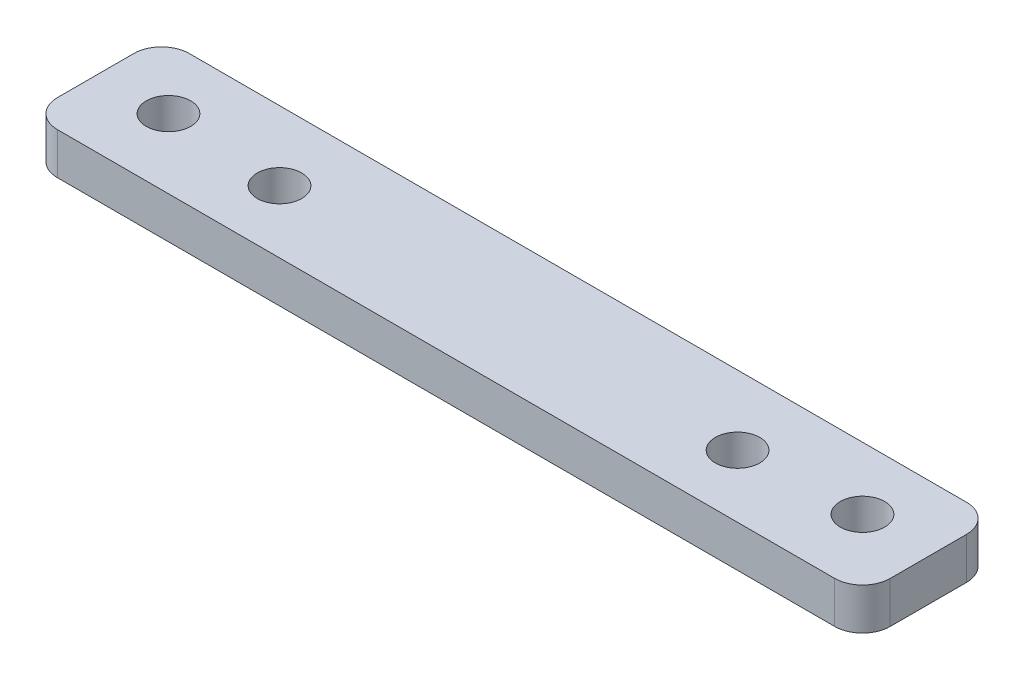
ISO-10303-21;
HEADER;
FILE_DESCRIPTION(('STEP AP214'),'2;1');
FILE_NAME('part.step','',(''),(''),'','','');
FILE_SCHEMA(('AUTOMOTIVE_DESIGN { 1 0 10303 214 1 1 1 1 }'));
ENDSEC;
DATA;
#1=APPLICATION_CONTEXT('core data for automotive mechanical design processes');
#2=APPLICATION_PROTOCOL_DEFINITION('international standard','automotive_design',2000,#1);
#3=PRODUCT_CONTEXT('',#1,'mechanical');
#4=PRODUCT('Part','Part','',(#3));
#5=PRODUCT_RELATED_PRODUCT_CATEGORY('part','',(#4));
#6=PRODUCT_DEFINITION_FORMATION('','',#4);
#7=PRODUCT_DEFINITION_CONTEXT('part definition',#1,'design');
#8=PRODUCT_DEFINITION('design','',#6,#7);
#9=PRODUCT_DEFINITION_SHAPE('','',#8);
#10=(LENGTH_UNIT() NAMED_UNIT(*) SI_UNIT(.MILLI.,.METRE.));
#11=(NAMED_UNIT(*) PLANE_ANGLE_UNIT() SI_UNIT($,.RADIAN.));
#12=(NAMED_UNIT(*) SI_UNIT($,.STERADIAN.) SOLID_ANGLE_UNIT());
#13=UNCERTAINTY_MEASURE_WITH_UNIT(LENGTH_MEASURE(1.E-05),#10,'distance_accuracy_value','');
#14=(GEOMETRIC_REPRESENTATION_CONTEXT(3) GLOBAL_UNCERTAINTY_ASSIGNED_CONTEXT((#13)) GLOBAL_UNIT_ASSIGNED_CONTEXT((#10,
#11,#12)) REPRESENTATION_CONTEXT('',''));
#15=CARTESIAN_POINT('',(0.,0.,0.));
#16=DIRECTION('',(0.,0.,1.));
#17=DIRECTION('',(1.,0.,0.));
#18=AXIS2_PLACEMENT_3D('',#15,#16,#17);
#19=CARTESIAN_POINT('',(-30.,3.,4.75));
#20=DIRECTION('',(1.,0.,0.));
#21=DIRECTION('',(0.,0.,-1.));
#22=AXIS2_PLACEMENT_3D('',#19,#20,#21);
#23=PLANE('',#22);
#24=DIRECTION('',(0.,0.,1.));
#25=VECTOR('',#24,1.);
#26=CARTESIAN_POINT('',(-30.,3.,4.75));
#27=LINE('',#26,#25);
#28=CARTESIAN_POINT('',(-30.,3.,-2.75));
#29=VERTEX_POINT('',#28);
#30=CARTESIAN_POINT('',(-30.,3.,2.75));
#31=VERTEX_POINT('',#30);
#32=EDGE_CURVE('E119',#29,#31,#27,.T.);
#33=ORIENTED_EDGE('',*,*,#32,.F.);
#34=DIRECTION('',(0.,-1.,0.));
#35=VECTOR('',#34,1.);
#36=CARTESIAN_POINT('',(-30.,3.,-2.75));
#37=LINE('',#36,#35);
#38=CARTESIAN_POINT('',(-30.,0.,-2.75));
#39=VERTEX_POINT('',#38);
#40=EDGE_CURVE('E104',#29,#39,#37,.T.);
#41=ORIENTED_EDGE('',*,*,#40,.T.);
#42=DIRECTION('',(0.,0.,1.));
#43=VECTOR('',#42,1.);
#44=CARTESIAN_POINT('',(-30.,0.,4.75));
#45=LINE('',#44,#43);
#46=CARTESIAN_POINT('',(-30.,0.,2.75));
#47=VERTEX_POINT('',#46);
#48=EDGE_CURVE('E116',#39,#47,#45,.T.);
#49=ORIENTED_EDGE('',*,*,#48,.T.);
#50=DIRECTION('',(0.,-1.,0.));
#51=VECTOR('',#50,1.);
#52=CARTESIAN_POINT('',(-30.,3.,2.75));
#53=LINE('',#52,#51);
#54=EDGE_CURVE('E121',#47,#31,#53,.F.);
#55=ORIENTED_EDGE('',*,*,#54,.T.);
#56=EDGE_LOOP('',(#33,#41,#49,#55));
#57=FACE_BOUND('',#56,.T.);
#58=ADVANCED_FACE('F34',(#57),#23,.F.);
#59=CARTESIAN_POINT('',(30.,3.,4.74999999999999));
#60=DIRECTION('',(0.,0.,-1.));
#61=DIRECTION('',(-1.,0.,0.));
#62=AXIS2_PLACEMENT_3D('',#59,#60,#61);
#63=PLANE('',#62);
#64=DIRECTION('',(1.,0.,0.));
#65=VECTOR('',#64,1.);
#66=CARTESIAN_POINT('',(30.,0.,4.74999999999999));
#67=LINE('',#66,#65);
#68=CARTESIAN_POINT('',(-28.,0.,4.75));
#69=VERTEX_POINT('',#68);
#70=CARTESIAN_POINT('',(28.,0.,4.74999999999999));
#71=VERTEX_POINT('',#70);
#72=EDGE_CURVE('E125',#69,#71,#67,.T.);
#73=ORIENTED_EDGE('',*,*,#72,.T.);
#74=DIRECTION('',(0.,-1.,0.));
#75=VECTOR('',#74,1.);
#76=CARTESIAN_POINT('',(28.,3.,4.74999999999999));
#77=LINE('',#76,#75);
#78=CARTESIAN_POINT('',(28.,3.,4.74999999999999));
#79=VERTEX_POINT('',#78);
#80=EDGE_CURVE('E11',#71,#79,#77,.F.);
#81=ORIENTED_EDGE('',*,*,#80,.T.);
#82=DIRECTION('',(1.,0.,0.));
#83=VECTOR('',#82,1.);
#84=CARTESIAN_POINT('',(30.,3.,4.74999999999999));
#85=LINE('',#84,#83);
#86=CARTESIAN_POINT('',(-28.,3.,4.75));
#87=VERTEX_POINT('',#86);
#88=EDGE_CURVE('E165',#87,#79,#85,.T.);
#89=ORIENTED_EDGE('',*,*,#88,.F.);
#90=DIRECTION('',(0.,-1.,0.));
#91=VECTOR('',#90,1.);
#92=CARTESIAN_POINT('',(-28.,3.,4.75));
#93=LINE('',#92,#91);
#94=EDGE_CURVE('E42',#87,#69,#93,.T.);
#95=ORIENTED_EDGE('',*,*,#94,.T.);
#96=EDGE_LOOP('',(#73,#81,#89,#95));
#97=FACE_BOUND('',#96,.T.);
#98=ADVANCED_FACE('F163',(#97),#63,.F.);
#99=CARTESIAN_POINT('',(30.,3.,4.74999999999999));
#100=DIRECTION('',(-1.,0.,0.));
#101=DIRECTION('',(0.,0.,1.));
#102=AXIS2_PLACEMENT_3D('',#99,#100,#101);
#103=PLANE('',#102);
#104=DIRECTION('',(0.,0.,-1.));
#105=VECTOR('',#104,1.);
#106=CARTESIAN_POINT('',(30.,0.,4.74999999999999));
#107=LINE('',#106,#105);
#108=CARTESIAN_POINT('',(30.,0.,2.75));
#109=VERTEX_POINT('',#108);
#110=CARTESIAN_POINT('',(30.,0.,-2.75));
#111=VERTEX_POINT('',#110);
#112=EDGE_CURVE('E129',#109,#111,#107,.T.);
#113=ORIENTED_EDGE('',*,*,#112,.T.);
#114=DIRECTION('',(0.,-1.,0.));
#115=VECTOR('',#114,1.);
#116=CARTESIAN_POINT('',(30.,3.,-2.75));
#117=LINE('',#116,#115);
#118=CARTESIAN_POINT('',(30.,3.,-2.75));
#119=VERTEX_POINT('',#118);
#120=EDGE_CURVE('E49',#111,#119,#117,.F.);
#121=ORIENTED_EDGE('',*,*,#120,.T.);
#122=DIRECTION('',(0.,0.,-1.));
#123=VECTOR('',#122,1.);
#124=CARTESIAN_POINT('',(30.,3.,4.74999999999999));
#125=LINE('',#124,#123);
#126=CARTESIAN_POINT('',(30.,3.,2.75));
#127=VERTEX_POINT('',#126);
#128=EDGE_CURVE('E173',#127,#119,#125,.T.);
#129=ORIENTED_EDGE('',*,*,#128,.F.);
#130=DIRECTION('',(0.,-1.,0.));
#131=VECTOR('',#130,1.);
#132=CARTESIAN_POINT('',(30.,3.,2.75));
#133=LINE('',#132,#131);
#134=EDGE_CURVE('E156',#127,#109,#133,.T.);
#135=ORIENTED_EDGE('',*,*,#134,.T.);
#136=EDGE_LOOP('',(#113,#121,#129,#135));
#137=FACE_BOUND('',#136,.T.);
#138=ADVANCED_FACE('F172',(#137),#103,.F.);
#139=CARTESIAN_POINT('',(30.,3.,-4.75000000000001));
#140=DIRECTION('',(0.,0.,1.));
#141=DIRECTION('',(1.,0.,0.));
#142=AXIS2_PLACEMENT_3D('',#139,#140,#141);
#143=PLANE('',#142);
#144=DIRECTION('',(-1.,0.,0.));
#145=VECTOR('',#144,1.);
#146=CARTESIAN_POINT('',(30.,0.,-4.75000000000001));
#147=LINE('',#146,#145);
#148=CARTESIAN_POINT('',(28.,0.,-4.75000000000001));
#149=VERTEX_POINT('',#148);
#150=CARTESIAN_POINT('',(-28.,0.,-4.75));
#151=VERTEX_POINT('',#150);
#152=EDGE_CURVE('E139',#149,#151,#147,.T.);
#153=ORIENTED_EDGE('',*,*,#152,.T.);
#154=DIRECTION('',(0.,-1.,0.));
#155=VECTOR('',#154,1.);
#156=CARTESIAN_POINT('',(-28.,3.,-4.75));
#157=LINE('',#156,#155);
#158=CARTESIAN_POINT('',(-28.,3.,-4.75));
#159=VERTEX_POINT('',#158);
#160=EDGE_CURVE('E105',#151,#159,#157,.F.);
#161=ORIENTED_EDGE('',*,*,#160,.T.);
#162=DIRECTION('',(-1.,0.,0.));
#163=VECTOR('',#162,1.);
#164=CARTESIAN_POINT('',(30.,3.,-4.75000000000001));
#165=LINE('',#164,#163);
#166=CARTESIAN_POINT('',(28.,3.,-4.75000000000001));
#167=VERTEX_POINT('',#166);
#168=EDGE_CURVE('E135',#167,#159,#165,.T.);
#169=ORIENTED_EDGE('',*,*,#168,.F.);
#170=DIRECTION('',(0.,-1.,0.));
#171=VECTOR('',#170,1.);
#172=CARTESIAN_POINT('',(28.,3.,-4.75000000000001));
#173=LINE('',#172,#171);
#174=EDGE_CURVE('E110',#167,#149,#173,.T.);
#175=ORIENTED_EDGE('',*,*,#174,.T.);
#176=EDGE_LOOP('',(#153,#161,#169,#175));
#177=FACE_BOUND('',#176,.T.);
#178=ADVANCED_FACE('F212',(#177),#143,.F.);
#179=CARTESIAN_POINT('',(0.,3.,0.));
#180=DIRECTION('',(0.,1.,0.));
#181=DIRECTION('',(0.,0.,1.));
#182=AXIS2_PLACEMENT_3D('',#179,#180,#181);
#183=PLANE('',#182);
#184=CARTESIAN_POINT('',(16.5,3.,0.25));
#185=DIRECTION('',(0.,1.,0.));
#186=DIRECTION('',(0.,0.,-1.));
#187=AXIS2_PLACEMENT_3D('',#184,#185,#186);
#188=CIRCLE('',#187,1.6);
#189=CARTESIAN_POINT('',(16.5,3.,-1.35));
#190=VERTEX_POINT('',#189);
#191=EDGE_CURVE('E194',#190,#190,#188,.T.);
#192=ORIENTED_EDGE('',*,*,#191,.F.);
#193=EDGE_LOOP('',(#192));
#194=FACE_BOUND('',#193,.T.);
#195=CARTESIAN_POINT('',(25.,3.,-0.250000000000008));
#196=DIRECTION('',(0.,1.,0.));
#197=DIRECTION('',(0.,0.,-1.));
#198=AXIS2_PLACEMENT_3D('',#195,#196,#197);
#199=CIRCLE('',#198,1.6);
#200=CARTESIAN_POINT('',(25.,3.,-1.85000000000001));
#201=VERTEX_POINT('',#200);
#202=EDGE_CURVE('E188',#201,#201,#199,.T.);
#203=ORIENTED_EDGE('',*,*,#202,.F.);
#204=EDGE_LOOP('',(#203));
#205=FACE_BOUND('',#204,.T.);
#206=CARTESIAN_POINT('',(-25.,3.,-0.250000000000008));
#207=DIRECTION('',(0.,1.,0.));
#208=DIRECTION('',(0.,0.,1.));
#209=AXIS2_PLACEMENT_3D('',#206,#207,#208);
#210=CIRCLE('',#209,1.6);
#211=CARTESIAN_POINT('',(-25.,3.,1.34999999999999));
#212=VERTEX_POINT('',#211);
#213=EDGE_CURVE('E182',#212,#212,#210,.T.);
#214=ORIENTED_EDGE('',*,*,#213,.F.);
#215=EDGE_LOOP('',(#214));
#216=FACE_BOUND('',#215,.T.);
#217=CARTESIAN_POINT('',(-16.5,3.,0.25));
#218=DIRECTION('',(0.,1.,0.));
#219=DIRECTION('',(0.,0.,1.));
#220=AXIS2_PLACEMENT_3D('',#217,#218,#219);
#221=CIRCLE('',#220,1.6);
#222=CARTESIAN_POINT('',(-16.5,3.,1.85));
#223=VERTEX_POINT('',#222);
#224=EDGE_CURVE('E132',#223,#223,#221,.T.);
#225=ORIENTED_EDGE('',*,*,#224,.F.);
#226=EDGE_LOOP('',(#225));
#227=FACE_BOUND('',#226,.T.);
#228=ORIENTED_EDGE('',*,*,#168,.T.);
#229=CARTESIAN_POINT('',(-28.,3.,-2.75));
#230=DIRECTION('',(0.,1.,0.));
#231=DIRECTION('',(0.,0.,1.));
#232=AXIS2_PLACEMENT_3D('',#229,#230,#231);
#233=CIRCLE('',#232,2.);
#234=EDGE_CURVE('E154',#159,#29,#233,.T.);
#235=ORIENTED_EDGE('',*,*,#234,.T.);
#236=ORIENTED_EDGE('',*,*,#32,.T.);
#237=CARTESIAN_POINT('',(-28.,3.,2.75));
#238=DIRECTION('',(0.,1.,0.));
#239=DIRECTION('',(0.,0.,1.));
#240=AXIS2_PLACEMENT_3D('',#237,#238,#239);
#241=CIRCLE('',#240,2.);
#242=EDGE_CURVE('E149',#31,#87,#241,.T.);
#243=ORIENTED_EDGE('',*,*,#242,.T.);
#244=ORIENTED_EDGE('',*,*,#88,.T.);
#245=CARTESIAN_POINT('',(28.,3.,2.75));
#246=DIRECTION('',(0.,1.,0.));
#247=DIRECTION('',(0.,0.,1.));
#248=AXIS2_PLACEMENT_3D('',#245,#246,#247);
#249=CIRCLE('',#248,2.);
#250=EDGE_CURVE('E56',#79,#127,#249,.T.);
#251=ORIENTED_EDGE('',*,*,#250,.T.);
#252=ORIENTED_EDGE('',*,*,#128,.T.);
#253=CARTESIAN_POINT('',(28.,3.,-2.75));
#254=DIRECTION('',(0.,1.,0.));
#255=DIRECTION('',(0.,0.,1.));
#256=AXIS2_PLACEMENT_3D('',#253,#254,#255);
#257=CIRCLE('',#256,2.);
#258=EDGE_CURVE('E152',#119,#167,#257,.T.);
#259=ORIENTED_EDGE('',*,*,#258,.T.);
#260=EDGE_LOOP('',(#228,#235,#236,#243,#244,#251,#252,#259));
#261=FACE_BOUND('',#260,.T.);
#262=ADVANCED_FACE('F209',(#194,#205,#216,#227,#261),#183,.T.);
#263=CARTESIAN_POINT('',(0.,0.,0.));
#264=DIRECTION('',(0.,1.,0.));
#265=DIRECTION('',(0.,0.,1.));
#266=AXIS2_PLACEMENT_3D('',#263,#264,#265);
#267=PLANE('',#266);
#268=CARTESIAN_POINT('',(16.5,0.,0.25));
#269=DIRECTION('',(0.,1.,0.));
#270=DIRECTION('',(0.,0.,-1.));
#271=AXIS2_PLACEMENT_3D('',#268,#269,#270);
#272=CIRCLE('',#271,1.6);
#273=CARTESIAN_POINT('',(16.5,0.,-1.35));
#274=VERTEX_POINT('',#273);
#275=EDGE_CURVE('E191',#274,#274,#272,.T.);
#276=ORIENTED_EDGE('',*,*,#275,.T.);
#277=EDGE_LOOP('',(#276));
#278=FACE_BOUND('',#277,.T.);
#279=CARTESIAN_POINT('',(25.,0.,-0.250000000000008));
#280=DIRECTION('',(0.,1.,0.));
#281=DIRECTION('',(0.,0.,-1.));
#282=AXIS2_PLACEMENT_3D('',#279,#280,#281);
#283=CIRCLE('',#282,1.6);
#284=CARTESIAN_POINT('',(25.,0.,-1.85000000000001));
#285=VERTEX_POINT('',#284);
#286=EDGE_CURVE('E185',#285,#285,#283,.T.);
#287=ORIENTED_EDGE('',*,*,#286,.T.);
#288=EDGE_LOOP('',(#287));
#289=FACE_BOUND('',#288,.T.);
#290=CARTESIAN_POINT('',(-25.,0.,-0.250000000000008));
#291=DIRECTION('',(0.,1.,0.));
#292=DIRECTION('',(0.,0.,1.));
#293=AXIS2_PLACEMENT_3D('',#290,#291,#292);
#294=CIRCLE('',#293,1.6);
#295=CARTESIAN_POINT('',(-25.,0.,1.34999999999999));
#296=VERTEX_POINT('',#295);
#297=EDGE_CURVE('E180',#296,#296,#294,.T.);
#298=ORIENTED_EDGE('',*,*,#297,.T.);
#299=EDGE_LOOP('',(#298));
#300=FACE_BOUND('',#299,.T.);
#301=CARTESIAN_POINT('',(-16.5,0.,0.25));
#302=DIRECTION('',(0.,1.,0.));
#303=DIRECTION('',(0.,0.,1.));
#304=AXIS2_PLACEMENT_3D('',#301,#302,#303);
#305=CIRCLE('',#304,1.6);
#306=CARTESIAN_POINT('',(-16.5,0.,1.85));
#307=VERTEX_POINT('',#306);
#308=EDGE_CURVE('E126',#307,#307,#305,.T.);
#309=ORIENTED_EDGE('',*,*,#308,.T.);
#310=EDGE_LOOP('',(#309));
#311=FACE_BOUND('',#310,.T.);
#312=ORIENTED_EDGE('',*,*,#48,.F.);
#313=CARTESIAN_POINT('',(-28.,0.,-2.75));
#314=DIRECTION('',(0.,1.,0.));
#315=DIRECTION('',(0.,0.,1.));
#316=AXIS2_PLACEMENT_3D('',#313,#314,#315);
#317=CIRCLE('',#316,2.);
#318=EDGE_CURVE('E100',#39,#151,#317,.F.);
#319=ORIENTED_EDGE('',*,*,#318,.T.);
#320=ORIENTED_EDGE('',*,*,#152,.F.);
#321=CARTESIAN_POINT('',(28.,0.,-2.75));
#322=DIRECTION('',(0.,1.,0.));
#323=DIRECTION('',(0.,0.,1.));
#324=AXIS2_PLACEMENT_3D('',#321,#322,#323);
#325=CIRCLE('',#324,2.);
#326=EDGE_CURVE('E111',#149,#111,#325,.F.);
#327=ORIENTED_EDGE('',*,*,#326,.T.);
#328=ORIENTED_EDGE('',*,*,#112,.F.);
#329=CARTESIAN_POINT('',(28.,0.,2.75));
#330=DIRECTION('',(0.,1.,0.));
#331=DIRECTION('',(0.,0.,1.));
#332=AXIS2_PLACEMENT_3D('',#329,#330,#331);
#333=CIRCLE('',#332,2.);
#334=EDGE_CURVE('E143',#109,#71,#333,.F.);
#335=ORIENTED_EDGE('',*,*,#334,.T.);
#336=ORIENTED_EDGE('',*,*,#72,.F.);
#337=CARTESIAN_POINT('',(-28.,0.,2.75));
#338=DIRECTION('',(0.,1.,0.));
#339=DIRECTION('',(0.,0.,1.));
#340=AXIS2_PLACEMENT_3D('',#337,#338,#339);
#341=CIRCLE('',#340,2.);
#342=EDGE_CURVE('E120',#69,#47,#341,.F.);
#343=ORIENTED_EDGE('',*,*,#342,.T.);
#344=EDGE_LOOP('',(#312,#319,#320,#327,#328,#335,#336,#343));
#345=FACE_BOUND('',#344,.T.);
#346=ADVANCED_FACE('F123',(#278,#289,#300,#311,#345),#267,.F.);
#347=CARTESIAN_POINT('',(-16.5,0.,0.25));
#348=DIRECTION('',(0.,1.,0.));
#349=DIRECTION('',(0.,0.,1.));
#350=AXIS2_PLACEMENT_3D('',#347,#348,#349);
#351=CYLINDRICAL_SURFACE('',#350,1.6);
#352=ORIENTED_EDGE('',*,*,#308,.F.);
#353=EDGE_LOOP('',(#352));
#354=FACE_BOUND('',#353,.T.);
#355=ORIENTED_EDGE('',*,*,#224,.T.);
#356=EDGE_LOOP('',(#355));
#357=FACE_BOUND('',#356,.T.);
#358=ADVANCED_FACE('F243',(#354,#357),#351,.F.);
#359=CARTESIAN_POINT('',(-25.,0.,-0.250000000000008));
#360=DIRECTION('',(0.,1.,0.));
#361=DIRECTION('',(0.,0.,1.));
#362=AXIS2_PLACEMENT_3D('',#359,#360,#361);
#363=CYLINDRICAL_SURFACE('',#362,1.6);
#364=ORIENTED_EDGE('',*,*,#297,.F.);
#365=EDGE_LOOP('',(#364));
#366=FACE_BOUND('',#365,.T.);
#367=ORIENTED_EDGE('',*,*,#213,.T.);
#368=EDGE_LOOP('',(#367));
#369=FACE_BOUND('',#368,.T.);
#370=ADVANCED_FACE('F247',(#366,#369),#363,.F.);
#371=CARTESIAN_POINT('',(25.,0.,-0.250000000000008));
#372=DIRECTION('',(0.,1.,0.));
#373=DIRECTION('',(0.,0.,1.));
#374=AXIS2_PLACEMENT_3D('',#371,#372,#373);
#375=CYLINDRICAL_SURFACE('',#374,1.6);
#376=ORIENTED_EDGE('',*,*,#286,.F.);
#377=EDGE_LOOP('',(#376));
#378=FACE_BOUND('',#377,.T.);
#379=ORIENTED_EDGE('',*,*,#202,.T.);
#380=EDGE_LOOP('',(#379));
#381=FACE_BOUND('',#380,.T.);
#382=ADVANCED_FACE('F205',(#378,#381),#375,.F.);
#383=CARTESIAN_POINT('',(16.5,0.,0.25));
#384=DIRECTION('',(0.,1.,0.));
#385=DIRECTION('',(0.,0.,1.));
#386=AXIS2_PLACEMENT_3D('',#383,#384,#385);
#387=CYLINDRICAL_SURFACE('',#386,1.6);
#388=ORIENTED_EDGE('',*,*,#275,.F.);
#389=EDGE_LOOP('',(#388));
#390=FACE_BOUND('',#389,.T.);
#391=ORIENTED_EDGE('',*,*,#191,.T.);
#392=EDGE_LOOP('',(#391));
#393=FACE_BOUND('',#392,.T.);
#394=ADVANCED_FACE('F202',(#390,#393),#387,.F.);
#395=CARTESIAN_POINT('',(-28.,3.,-2.75));
#396=DIRECTION('',(0.,-1.,0.));
#397=DIRECTION('',(0.,0.,-1.));
#398=AXIS2_PLACEMENT_3D('',#395,#396,#397);
#399=CYLINDRICAL_SURFACE('',#398,2.);
#400=ORIENTED_EDGE('',*,*,#234,.F.);
#401=ORIENTED_EDGE('',*,*,#160,.F.);
#402=ORIENTED_EDGE('',*,*,#318,.F.);
#403=ORIENTED_EDGE('',*,*,#40,.F.);
#404=EDGE_LOOP('',(#400,#401,#402,#403));
#405=FACE_BOUND('',#404,.T.);
#406=ADVANCED_FACE('F103',(#405),#399,.T.);
#407=CARTESIAN_POINT('',(28.,3.,-2.75));
#408=DIRECTION('',(0.,-1.,0.));
#409=DIRECTION('',(0.,0.,-1.));
#410=AXIS2_PLACEMENT_3D('',#407,#408,#409);
#411=CYLINDRICAL_SURFACE('',#410,2.);
#412=ORIENTED_EDGE('',*,*,#258,.F.);
#413=ORIENTED_EDGE('',*,*,#120,.F.);
#414=ORIENTED_EDGE('',*,*,#326,.F.);
#415=ORIENTED_EDGE('',*,*,#174,.F.);
#416=EDGE_LOOP('',(#412,#413,#414,#415));
#417=FACE_BOUND('',#416,.T.);
#418=ADVANCED_FACE('F223',(#417),#411,.T.);
#419=CARTESIAN_POINT('',(28.,3.,2.75));
#420=DIRECTION('',(0.,-1.,0.));
#421=DIRECTION('',(0.,0.,-1.));
#422=AXIS2_PLACEMENT_3D('',#419,#420,#421);
#423=CYLINDRICAL_SURFACE('',#422,2.);
#424=ORIENTED_EDGE('',*,*,#250,.F.);
#425=ORIENTED_EDGE('',*,*,#80,.F.);
#426=ORIENTED_EDGE('',*,*,#334,.F.);
#427=ORIENTED_EDGE('',*,*,#134,.F.);
#428=EDGE_LOOP('',(#424,#425,#426,#427));
#429=FACE_BOUND('',#428,.T.);
#430=ADVANCED_FACE('F171',(#429),#423,.T.);
#431=CARTESIAN_POINT('',(-28.,3.,2.75));
#432=DIRECTION('',(0.,-1.,0.));
#433=DIRECTION('',(0.,0.,-1.));
#434=AXIS2_PLACEMENT_3D('',#431,#432,#433);
#435=CYLINDRICAL_SURFACE('',#434,2.);
#436=ORIENTED_EDGE('',*,*,#242,.F.);
#437=ORIENTED_EDGE('',*,*,#54,.F.);
#438=ORIENTED_EDGE('',*,*,#342,.F.);
#439=ORIENTED_EDGE('',*,*,#94,.F.);
#440=EDGE_LOOP('',(#436,#437,#438,#439));
#441=FACE_BOUND('',#440,.T.);
#442=ADVANCED_FACE('F36',(#441),#435,.T.);
#443=CLOSED_SHELL('',(#58,#98,#138,#178,#262,#346,#358,#370,#382,#394,#406,#418,#430,#442));
#444=MANIFOLD_SOLID_BREP('B2',#443);
#445=ADVANCED_BREP_SHAPE_REPRESENTATION('',(#18,#444),#14);
#446=SHAPE_DEFINITION_REPRESENTATION(#9,#445);
ENDSEC;
END-ISO-10303-21;
